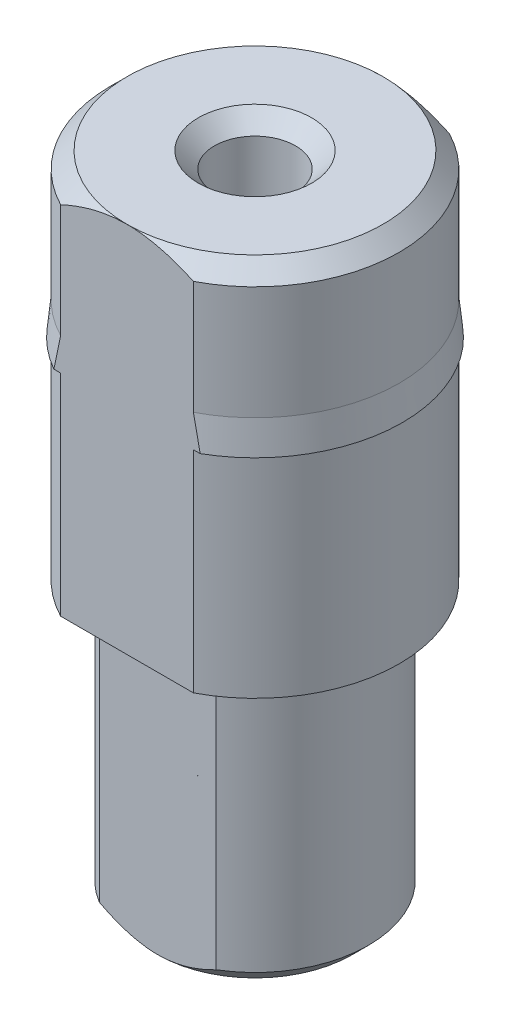
ISO-10303-21;
HEADER;
FILE_DESCRIPTION(('STEP AP214'),'2;1');
FILE_NAME('part.step','',(''),(''),'','','');
FILE_SCHEMA(('AUTOMOTIVE_DESIGN { 1 0 10303 214 1 1 1 1 }'));
ENDSEC;
DATA;
#1=APPLICATION_CONTEXT('core data for automotive mechanical design processes');
#2=APPLICATION_PROTOCOL_DEFINITION('international standard','automotive_design',2000,#1);
#3=PRODUCT_CONTEXT('',#1,'mechanical');
#4=PRODUCT('Part','Part','',(#3));
#5=PRODUCT_RELATED_PRODUCT_CATEGORY('part','',(#4));
#6=PRODUCT_DEFINITION_FORMATION('','',#4);
#7=PRODUCT_DEFINITION_CONTEXT('part definition',#1,'design');
#8=PRODUCT_DEFINITION('design','',#6,#7);
#9=PRODUCT_DEFINITION_SHAPE('','',#8);
#10=(LENGTH_UNIT() NAMED_UNIT(*) SI_UNIT(.MILLI.,.METRE.));
#11=(NAMED_UNIT(*) PLANE_ANGLE_UNIT() SI_UNIT($,.RADIAN.));
#12=(NAMED_UNIT(*) SI_UNIT($,.STERADIAN.) SOLID_ANGLE_UNIT());
#13=UNCERTAINTY_MEASURE_WITH_UNIT(LENGTH_MEASURE(1.E-05),#10,'distance_accuracy_value','');
#14=(GEOMETRIC_REPRESENTATION_CONTEXT(3) GLOBAL_UNCERTAINTY_ASSIGNED_CONTEXT((#13)) GLOBAL_UNIT_ASSIGNED_CONTEXT((#10,
#11,#12)) REPRESENTATION_CONTEXT('',''));
#15=CARTESIAN_POINT('',(0.,0.,0.));
#16=DIRECTION('',(0.,0.,1.));
#17=DIRECTION('',(1.,0.,0.));
#18=AXIS2_PLACEMENT_3D('',#15,#16,#17);
#19=CARTESIAN_POINT('',(-4.565003659,15.,3.95));
#20=DIRECTION('',(0.,-1.,0.));
#21=DIRECTION('',(0.,0.,-1.));
#22=AXIS2_PLACEMENT_3D('',#19,#20,#21);
#23=PLANE('',#22);
#24=DIRECTION('',(-1.,0.,0.));
#25=VECTOR('',#24,1.);
#26=CARTESIAN_POINT('',(-3.2996950765,15.,3.95));
#27=LINE('',#26,#25);
#28=CARTESIAN_POINT('',(-2.04939015250535,15.,3.95));
#29=VERTEX_POINT('',#28);
#30=CARTESIAN_POINT('',(-2.25831795812725,15.,3.95));
#31=VERTEX_POINT('',#30);
#32=EDGE_CURVE('E447',#29,#31,#27,.T.);
#33=ORIENTED_EDGE('',*,*,#32,.T.);
#34=CARTESIAN_POINT('',(0.,14.9999999999999,0.));
#35=DIRECTION('',(0.,-1.,0.));
#36=DIRECTION('',(0.,0.,-1.));
#37=AXIS2_PLACEMENT_3D('',#34,#35,#36);
#38=CIRCLE('',#37,4.55000000000001);
#39=CARTESIAN_POINT('',(-2.2583179582148,14.9999999995654,-3.95));
#40=VERTEX_POINT('',#39);
#41=EDGE_CURVE('E306',#31,#40,#38,.T.);
#42=ORIENTED_EDGE('',*,*,#41,.T.);
#43=DIRECTION('',(1.,0.,0.));
#44=VECTOR('',#43,1.);
#45=CARTESIAN_POINT('',(-3.2996950765,15.,-3.95));
#46=LINE('',#45,#44);
#47=CARTESIAN_POINT('',(-2.04939015250535,15.,-3.95));
#48=VERTEX_POINT('',#47);
#49=EDGE_CURVE('E449',#40,#48,#46,.T.);
#50=ORIENTED_EDGE('',*,*,#49,.T.);
#51=CARTESIAN_POINT('',(0.,15.,0.));
#52=DIRECTION('',(0.,-1.,0.));
#53=DIRECTION('',(1.,0.,0.));
#54=AXIS2_PLACEMENT_3D('',#51,#52,#53);
#55=CIRCLE('',#54,4.45);
#56=EDGE_CURVE('E455',#48,#29,#55,.F.);
#57=ORIENTED_EDGE('',*,*,#56,.T.);
#58=EDGE_LOOP('',(#33,#42,#50,#57));
#59=FACE_BOUND('',#58,.T.);
#60=ADVANCED_FACE('F17',(#59),#23,.T.);
#61=CARTESIAN_POINT('',(0.,8.5,0.));
#62=DIRECTION('',(0.,-1.,0.));
#63=DIRECTION('',(0.,0.,-1.));
#64=AXIS2_PLACEMENT_3D('',#61,#62,#63);
#65=CYLINDRICAL_SURFACE('',#64,3.5);
#66=CARTESIAN_POINT('',(0.,8.5,0.));
#67=DIRECTION('',(0.,-1.,0.));
#68=DIRECTION('',(0.,0.,-1.));
#69=AXIS2_PLACEMENT_3D('',#66,#67,#68);
#70=CIRCLE('',#69,3.5);
#71=CARTESIAN_POINT('',(1.80277564077817,8.5,2.99999999825));
#72=VERTEX_POINT('',#71);
#73=CARTESIAN_POINT('',(1.80277564077817,8.5,-2.99999999825));
#74=VERTEX_POINT('',#73);
#75=EDGE_CURVE('E402',#72,#74,#70,.F.);
#76=ORIENTED_EDGE('',*,*,#75,.F.);
#77=DIRECTION('',(0.,-1.,0.));
#78=VECTOR('',#77,1.);
#79=CARTESIAN_POINT('',(1.802775638,4.2245,3.));
#80=LINE('',#79,#78);
#81=CARTESIAN_POINT('',(1.802775637866,0.500000000068994,3.));
#82=VERTEX_POINT('',#81);
#83=EDGE_CURVE('E169',#72,#82,#80,.T.);
#84=ORIENTED_EDGE('',*,*,#83,.T.);
#85=CARTESIAN_POINT('',(0.,0.499999999999945,0.));
#86=DIRECTION('',(0.,1.,0.));
#87=DIRECTION('',(0.,0.,1.));
#88=AXIS2_PLACEMENT_3D('',#85,#86,#87);
#89=CIRCLE('',#88,3.5);
#90=CARTESIAN_POINT('',(1.80277563773255,0.500000000000285,-3.));
#91=VERTEX_POINT('',#90);
#92=EDGE_CURVE('E193',#82,#91,#89,.T.);
#93=ORIENTED_EDGE('',*,*,#92,.T.);
#94=DIRECTION('',(0.,1.,0.));
#95=VECTOR('',#94,1.);
#96=CARTESIAN_POINT('',(1.802775638,4.2245,-3.));
#97=LINE('',#96,#95);
#98=EDGE_CURVE('E443',#91,#74,#97,.T.);
#99=ORIENTED_EDGE('',*,*,#98,.T.);
#100=EDGE_LOOP('',(#76,#84,#93,#99));
#101=FACE_BOUND('',#100,.T.);
#102=ADVANCED_FACE('F323',(#101),#65,.T.);
#103=CARTESIAN_POINT('',(-1.802775638,-0.051,-3.));
#104=DIRECTION('',(0.,0.,1.));
#105=DIRECTION('',(1.,0.,0.));
#106=AXIS2_PLACEMENT_3D('',#103,#104,#105);
#107=PLANE('',#106);
#108=DIRECTION('',(-1.,0.,0.));
#109=VECTOR('',#108,1.);
#110=CARTESIAN_POINT('',(0.,8.5,-2.9999999965));
#111=LINE('',#110,#109);
#112=CARTESIAN_POINT('',(-1.80277564097783,8.5,-2.9999999980495));
#113=VERTEX_POINT('',#112);
#114=EDGE_CURVE('E399',#74,#113,#111,.T.);
#115=ORIENTED_EDGE('',*,*,#114,.F.);
#116=ORIENTED_EDGE('',*,*,#98,.F.);
#117=CARTESIAN_POINT('',(1.80277563749583,0.499999999802859,-3.00000000013552));
#118=CARTESIAN_POINT('',(1.74059799916989,0.467980227535926,-3.00000000004997));
#119=CARTESIAN_POINT('',(1.67793156288771,0.436912729643096,-3.00000000001369));
#120=CARTESIAN_POINT('',(1.55150481095829,0.376989183162009,-2.9999999999863));
#121=CARTESIAN_POINT('',(1.48774384320323,0.348134513168375,-2.99999999999521));
#122=CARTESIAN_POINT('',(1.29390940841206,0.265043685178306,-3.00000000000963));
#123=CARTESIAN_POINT('',(1.1621055921902,0.214713573566235,-3.00000000000254));
#124=CARTESIAN_POINT('',(0.898117110232975,0.129141794008996,-2.99999999999754));
#125=CARTESIAN_POINT('',(0.766070510700231,0.0934813168375939,-2.99999999999936));
#126=CARTESIAN_POINT('',(0.498920669687579,0.0384190268531843,-3.00000000000063));
#127=CARTESIAN_POINT('',(0.36382927640349,0.018962633927783,-3.00000000000009));
#128=CARTESIAN_POINT('',(0.190263755353593,0.00578686201031933,-2.99999999999998));
#129=CARTESIAN_POINT('',(0.152341872402627,0.00362502580761151,-2.99999999999999));
#130=CARTESIAN_POINT('',(0.0762827731524233,0.000729165844277481,-3.00000000000001));
#131=CARTESIAN_POINT('',(0.0381453252268328,1.23000245343402E-06,-3.00000000000002));
#132=CARTESIAN_POINT('',(-6.1530964462863E-10,0.,-3.));
#133=B_SPLINE_CURVE_WITH_KNOTS('',3,(#117,#118,#119,#120,#121,#122,#123,#124,#125,#126,#127,
#128,#129,#130,#131,#132),.UNSPECIFIED.,.F.,.F.,(4,2,2,2,2,2,2,4),(0.,0.209796717217032,
0.419723093796895,0.842353911309675,1.25190313187514,1.66006722651482,1.77399802873899,
1.88841151384664),.UNSPECIFIED.);
#134=CARTESIAN_POINT('',(-6.15309619412179E-10,0.,-3.));
#135=VERTEX_POINT('',#134);
#136=EDGE_CURVE('E307',#91,#135,#133,.T.);
#137=ORIENTED_EDGE('',*,*,#136,.T.);
#138=CARTESIAN_POINT('',(-6.15309619538574E-10,0.,-3.));
#139=CARTESIAN_POINT('',(-0.0460840994652807,-3.6941433051602E-06,-3.));
#140=CARTESIAN_POINT('',(-0.0921613164449531,0.00106240437093954,-3.));
#141=CARTESIAN_POINT('',(-0.184211814927705,0.00529939845313604,-3.));
#142=CARTESIAN_POINT('',(-0.230185111699788,0.0084699614961064,-3.));
#143=CARTESIAN_POINT('',(-0.367651467400195,0.0210698029959266,-3.));
#144=CARTESIAN_POINT('',(-0.458876724465673,0.0335875136790476,-3.));
#145=CARTESIAN_POINT('',(-0.638535562680846,0.0659462631301394,-3.));
#146=CARTESIAN_POINT('',(-0.72699050121273,0.0856718471588858,-3.));
#147=CARTESIAN_POINT('',(-0.902223751822309,0.131589533597441,-3.));
#148=CARTESIAN_POINT('',(-0.989001482320416,0.157783837177736,-3.));
#149=CARTESIAN_POINT('',(-1.13712031289708,0.207740864029572,-3.));
#150=CARTESIAN_POINT('',(-1.19890904958656,0.230199464833354,-3.));
#151=CARTESIAN_POINT('',(-1.32148458483405,0.2776714674565,-3.));
#152=CARTESIAN_POINT('',(-1.38227154234139,0.302684459356221,-3.));
#153=CARTESIAN_POINT('',(-1.50357773002713,0.355252574055036,-3.));
#154=CARTESIAN_POINT('',(-1.5640854643207,0.382834064727993,-3.));
#155=CARTESIAN_POINT('',(-1.68413781325299,0.439991922713463,-3.));
#156=CARTESIAN_POINT('',(-1.74368262236723,0.469567880817608,-3.));
#157=CARTESIAN_POINT('',(-1.80277563848523,0.500000000387977,-3.));
#158=B_SPLINE_CURVE_WITH_KNOTS('',3,(#138,#139,#140,#141,#142,#143,#144,#145,#146,#147,#148,
#149,#150,#151,#152,#153,#154,#155,#156,#157),.UNSPECIFIED.,.F.,.F.,(4,2,2,2,2,2,2,2,2,4),(0.,
0.138226809152246,0.276431782379928,0.552286625444179,0.823903796946395,1.09561352177657,
1.2927879730921,1.48993083212413,1.68938519780777,1.88879876487008),.UNSPECIFIED.);
#159=CARTESIAN_POINT('',(-1.80277563806566,0.499999999999973,-2.99999999979949));
#160=VERTEX_POINT('',#159);
#161=EDGE_CURVE('E181',#135,#160,#158,.T.);
#162=ORIENTED_EDGE('',*,*,#161,.T.);
#163=DIRECTION('',(0.,-1.,0.));
#164=VECTOR('',#163,1.);
#165=CARTESIAN_POINT('',(-1.80277563839932,4.5,-2.99999999959899));
#166=LINE('',#165,#164);
#167=EDGE_CURVE('E170',#160,#113,#166,.F.);
#168=ORIENTED_EDGE('',*,*,#167,.T.);
#169=EDGE_LOOP('',(#115,#116,#137,#162,#168));
#170=FACE_BOUND('',#169,.T.);
#171=ADVANCED_FACE('F319',(#170),#107,.F.);
#172=CARTESIAN_POINT('',(0.,8.5,0.));
#173=DIRECTION('',(0.,-1.,0.));
#174=DIRECTION('',(0.,0.,-1.));
#175=AXIS2_PLACEMENT_3D('',#172,#173,#174);
#176=CYLINDRICAL_SURFACE('',#175,3.5);
#177=CARTESIAN_POINT('',(0.,0.499999999999945,0.));
#178=DIRECTION('',(0.,1.,0.));
#179=DIRECTION('',(0.,0.,1.));
#180=AXIS2_PLACEMENT_3D('',#177,#178,#179);
#181=CIRCLE('',#180,3.5);
#182=CARTESIAN_POINT('',(-1.80277563808214,0.500000000111304,3.));
#183=VERTEX_POINT('',#182);
#184=EDGE_CURVE('E176',#160,#183,#181,.T.);
#185=ORIENTED_EDGE('',*,*,#184,.T.);
#186=DIRECTION('',(0.,1.,0.));
#187=VECTOR('',#186,1.);
#188=CARTESIAN_POINT('',(-1.802775638,4.2245,3.));
#189=LINE('',#188,#187);
#190=CARTESIAN_POINT('',(-1.80277564077817,8.5,2.99999999825));
#191=VERTEX_POINT('',#190);
#192=EDGE_CURVE('E158',#183,#191,#189,.T.);
#193=ORIENTED_EDGE('',*,*,#192,.T.);
#194=CARTESIAN_POINT('',(0.,8.5,0.));
#195=DIRECTION('',(0.,-1.,0.));
#196=DIRECTION('',(0.,0.,-1.));
#197=AXIS2_PLACEMENT_3D('',#194,#195,#196);
#198=CIRCLE('',#197,3.5);
#199=EDGE_CURVE('E398',#113,#191,#198,.F.);
#200=ORIENTED_EDGE('',*,*,#199,.F.);
#201=ORIENTED_EDGE('',*,*,#167,.F.);
#202=EDGE_LOOP('',(#185,#193,#200,#201));
#203=FACE_BOUND('',#202,.T.);
#204=ADVANCED_FACE('F182',(#203),#176,.T.);
#205=CARTESIAN_POINT('',(1.802775638,-0.051,3.));
#206=DIRECTION('',(0.,0.,-1.));
#207=DIRECTION('',(-1.,0.,0.));
#208=AXIS2_PLACEMENT_3D('',#205,#206,#207);
#209=PLANE('',#208);
#210=DIRECTION('',(1.,0.,0.));
#211=VECTOR('',#210,1.);
#212=CARTESIAN_POINT('',(0.,8.5,2.9999999965));
#213=LINE('',#212,#211);
#214=EDGE_CURVE('E164',#191,#72,#213,.T.);
#215=ORIENTED_EDGE('',*,*,#214,.F.);
#216=ORIENTED_EDGE('',*,*,#192,.F.);
#217=CARTESIAN_POINT('',(-1.80277563816428,0.500000000222663,3.));
#218=CARTESIAN_POINT('',(-1.7405979998369,0.467980227898223,3.));
#219=CARTESIAN_POINT('',(-1.67793156354221,0.436912729969964,3.));
#220=CARTESIAN_POINT('',(-1.55150481157755,0.37698918343884,3.));
#221=CARTESIAN_POINT('',(-1.48774384379976,0.348134513430598,3.));
#222=CARTESIAN_POINT('',(-1.29390940894163,0.265043685392213,3.));
#223=CARTESIAN_POINT('',(-1.16210559267718,0.214713573742106,3.));
#224=CARTESIAN_POINT('',(-0.898117110631753,0.129141794120821,3.));
#225=CARTESIAN_POINT('',(-0.76607051105363,0.093481316922939,3.));
#226=CARTESIAN_POINT('',(-0.498920669947155,0.0384190268942928,3.));
#227=CARTESIAN_POINT('',(-0.363829276614636,0.0189626339510926,3.));
#228=CARTESIAN_POINT('',(-0.190263755601701,0.00578686202710394,3.));
#229=CARTESIAN_POINT('',(-0.152341872737199,0.00362502582566791,3.));
#230=CARTESIAN_POINT('',(-0.0762827736607085,0.000729165858313931,3.));
#231=CARTESIAN_POINT('',(-0.0381453258223677,1.23001115626984E-06,3.));
#232=CARTESIAN_POINT('',(-6.73453388702835E-11,0.,3.));
#233=B_SPLINE_CURVE_WITH_KNOTS('',3,(#217,#218,#219,#220,#221,#222,#223,#224,#225,#226,#227,
#228,#229,#230,#231,#232),.UNSPECIFIED.,.F.,.F.,(4,2,2,2,2,2,2,4),(0.,0.20979671729781,
0.41972309395742,0.842353911630949,1.2519031323475,1.66006722713743,1.77399802910257,
1.88841151394897),.UNSPECIFIED.);
#234=CARTESIAN_POINT('',(-3.36726565919468E-11,0.,3.));
#235=VERTEX_POINT('',#234);
#236=EDGE_CURVE('E21',#183,#235,#233,.T.);
#237=ORIENTED_EDGE('',*,*,#236,.T.);
#238=CARTESIAN_POINT('',(-6.73453131838936E-11,0.,3.));
#239=CARTESIAN_POINT('',(0.0460840987747339,-3.69415378986877E-06,3.));
#240=CARTESIAN_POINT('',(0.0921613157467651,0.00106240434960413,3.));
#241=CARTESIAN_POINT('',(0.184211814214771,0.00529939840954038,3.));
#242=CARTESIAN_POINT('',(0.23018511097975,0.00846996144110207,3.));
#243=CARTESIAN_POINT('',(0.367651466659799,0.0210698029061708,3.));
#244=CARTESIAN_POINT('',(0.458876723712821,0.0335875135653797,3.));
#245=CARTESIAN_POINT('',(0.638535561904433,0.0659462629686653,3.));
#246=CARTESIAN_POINT('',(0.726990500425194,0.0856718469734601,3.));
#247=CARTESIAN_POINT('',(0.902223751013889,0.131589533364651,3.));
#248=CARTESIAN_POINT('',(0.989001481502234,0.157783836921531,3.));
#249=CARTESIAN_POINT('',(1.13712031209498,0.2077408637447,3.));
#250=CARTESIAN_POINT('',(1.19890904880956,0.230199464544477,3.));
#251=CARTESIAN_POINT('',(1.32148458410658,0.27767146716272,3.));
#252=CARTESIAN_POINT('',(1.38227154163835,0.302684459061544,3.));
#253=CARTESIAN_POINT('',(1.50357772937319,0.355252573761538,3.));
#254=CARTESIAN_POINT('',(1.56408546369141,0.382834064436631,3.));
#255=CARTESIAN_POINT('',(1.68413781267208,0.439991922428673,3.));
#256=CARTESIAN_POINT('',(1.74368262181006,0.469567880537252,3.));
#257=CARTESIAN_POINT('',(1.80277563795139,0.500000000113005,3.));
#258=B_SPLINE_CURVE_WITH_KNOTS('',3,(#238,#239,#240,#241,#242,#243,#244,#245,#246,#247,#248,
#249,#250,#251,#252,#253,#254,#255,#256,#257),.UNSPECIFIED.,.F.,.F.,(4,2,2,2,2,2,2,2,2,4),(0.,
0.138226809128589,0.276431782332671,0.552286625350198,0.823903796804165,1.09561352158594,
1.29278797296803,1.48993083206671,1.68938519782021,1.88879876495213),.UNSPECIFIED.);
#259=EDGE_CURVE('E315',#235,#82,#258,.T.);
#260=ORIENTED_EDGE('',*,*,#259,.T.);
#261=ORIENTED_EDGE('',*,*,#83,.F.);
#262=EDGE_LOOP('',(#215,#216,#237,#260,#261));
#263=FACE_BOUND('',#262,.T.);
#264=ADVANCED_FACE('F160',(#263),#209,.F.);
#265=CARTESIAN_POINT('',(2.034386494,15.,3.95));
#266=DIRECTION('',(0.,-1.,0.));
#267=DIRECTION('',(0.,0.,-1.));
#268=AXIS2_PLACEMENT_3D('',#265,#266,#267);
#269=PLANE('',#268);
#270=DIRECTION('',(-1.,0.,0.));
#271=VECTOR('',#270,1.);
#272=CARTESIAN_POINT('',(3.2996950765,15.,3.95));
#273=LINE('',#272,#271);
#274=CARTESIAN_POINT('',(2.25831795822744,14.9999999995027,3.95));
#275=VERTEX_POINT('',#274);
#276=CARTESIAN_POINT('',(2.04939015250535,15.,3.95));
#277=VERTEX_POINT('',#276);
#278=EDGE_CURVE('E185',#275,#277,#273,.T.);
#279=ORIENTED_EDGE('',*,*,#278,.T.);
#280=CARTESIAN_POINT('',(0.,15.,0.));
#281=DIRECTION('',(0.,-1.,0.));
#282=DIRECTION('',(1.,0.,0.));
#283=AXIS2_PLACEMENT_3D('',#280,#281,#282);
#284=CIRCLE('',#283,4.45);
#285=CARTESIAN_POINT('',(2.04939015250535,15.,-3.95));
#286=VERTEX_POINT('',#285);
#287=EDGE_CURVE('E475',#277,#286,#284,.F.);
#288=ORIENTED_EDGE('',*,*,#287,.T.);
#289=DIRECTION('',(1.,0.,0.));
#290=VECTOR('',#289,1.);
#291=CARTESIAN_POINT('',(3.2996950765,15.,-3.95));
#292=LINE('',#291,#290);
#293=CARTESIAN_POINT('',(2.25831795812725,15.,-3.95));
#294=VERTEX_POINT('',#293);
#295=EDGE_CURVE('E190',#286,#294,#292,.T.);
#296=ORIENTED_EDGE('',*,*,#295,.T.);
#297=CARTESIAN_POINT('',(0.,14.9999999999999,0.));
#298=DIRECTION('',(0.,-1.,0.));
#299=DIRECTION('',(0.,0.,-1.));
#300=AXIS2_PLACEMENT_3D('',#297,#298,#299);
#301=CIRCLE('',#300,4.55000000000001);
#302=EDGE_CURVE('E271',#294,#275,#301,.T.);
#303=ORIENTED_EDGE('',*,*,#302,.T.);
#304=EDGE_LOOP('',(#279,#288,#296,#303));
#305=FACE_BOUND('',#304,.T.);
#306=ADVANCED_FACE('F336',(#305),#269,.T.);
#307=CARTESIAN_POINT('',(0.,0.,0.));
#308=DIRECTION('',(0.,1.,0.));
#309=DIRECTION('',(0.,0.,1.));
#310=AXIS2_PLACEMENT_3D('',#307,#308,#309);
#311=CONICAL_SURFACE('',#310,3.,0.785398163397448);
#312=CARTESIAN_POINT('',(0.,0.,0.));
#313=DIRECTION('',(0.,1.,0.));
#314=DIRECTION('',(0.,0.,1.));
#315=AXIS2_PLACEMENT_3D('',#312,#313,#314);
#316=CIRCLE('',#315,3.);
#317=EDGE_CURVE('E179',#235,#135,#316,.F.);
#318=ORIENTED_EDGE('',*,*,#317,.F.);
#319=ORIENTED_EDGE('',*,*,#236,.F.);
#320=ORIENTED_EDGE('',*,*,#184,.F.);
#321=ORIENTED_EDGE('',*,*,#161,.F.);
#322=EDGE_LOOP('',(#318,#319,#320,#321));
#323=FACE_BOUND('',#322,.T.);
#324=ADVANCED_FACE('F175',(#323),#311,.T.);
#325=CARTESIAN_POINT('',(0.,0.,0.));
#326=DIRECTION('',(0.,1.,0.));
#327=DIRECTION('',(0.,0.,1.));
#328=AXIS2_PLACEMENT_3D('',#325,#326,#327);
#329=CONICAL_SURFACE('',#328,3.,0.785398163397448);
#330=ORIENTED_EDGE('',*,*,#92,.F.);
#331=ORIENTED_EDGE('',*,*,#259,.F.);
#332=CARTESIAN_POINT('',(0.,0.,0.));
#333=DIRECTION('',(0.,1.,0.));
#334=DIRECTION('',(0.,0.,1.));
#335=AXIS2_PLACEMENT_3D('',#332,#333,#334);
#336=CIRCLE('',#335,3.);
#337=EDGE_CURVE('E420',#135,#235,#336,.F.);
#338=ORIENTED_EDGE('',*,*,#337,.F.);
#339=ORIENTED_EDGE('',*,*,#136,.F.);
#340=EDGE_LOOP('',(#330,#331,#338,#339));
#341=FACE_BOUND('',#340,.T.);
#342=ADVANCED_FACE('F290',(#341),#329,.T.);
#343=CARTESIAN_POINT('',(0.,16.,0.));
#344=DIRECTION('',(0.,-1.,0.));
#345=DIRECTION('',(0.,0.,-1.));
#346=AXIS2_PLACEMENT_3D('',#343,#344,#345);
#347=CONICAL_SURFACE('',#346,4.45,0.0996686524911622);
#348=ORIENTED_EDGE('',*,*,#41,.F.);
#349=CARTESIAN_POINT('',(-2.04939015290256,16.0000000013756,3.95000000003666));
#350=CARTESIAN_POINT('',(-2.08545844786843,15.8335938390212,3.95000000001833));
#351=CARTESIAN_POINT('',(-2.12090324841155,15.667057411346,3.95000000000611));
#352=CARTESIAN_POINT('',(-2.19054584982861,15.3337240771599,3.94999999999389));
#353=CARTESIAN_POINT('',(-2.22474365109016,15.16692717073,3.94999999999389));
#354=CARTESIAN_POINT('',(-2.25831795831657,14.9999999990603,3.95));
#355=B_SPLINE_CURVE_WITH_KNOTS('',3,(#349,#350,#351,#352,#353,#354),.UNSPECIFIED.,.F.,.F.,(4,2,
4),(0.,0.510799804869968,1.02159945096563),.UNSPECIFIED.);
#356=CARTESIAN_POINT('',(-2.04939015235621,16.0000000006868,3.95));
#357=VERTEX_POINT('',#356);
#358=EDGE_CURVE('E299',#357,#31,#355,.T.);
#359=ORIENTED_EDGE('',*,*,#358,.F.);
#360=CARTESIAN_POINT('',(0.,16.,0.));
#361=DIRECTION('',(0.,-1.,0.));
#362=DIRECTION('',(0.,0.,-1.));
#363=AXIS2_PLACEMENT_3D('',#360,#361,#362);
#364=CIRCLE('',#363,4.45);
#365=CARTESIAN_POINT('',(-2.04939015234596,16.0000000007341,-3.95));
#366=VERTEX_POINT('',#365);
#367=EDGE_CURVE('E415',#357,#366,#364,.T.);
#368=ORIENTED_EDGE('',*,*,#367,.T.);
#369=CARTESIAN_POINT('',(-2.25831795830236,14.9999999991309,-3.95));
#370=CARTESIAN_POINT('',(-2.22474365107646,15.1669271708049,-3.95));
#371=CARTESIAN_POINT('',(-2.19054584981389,15.3337240772389,-3.95));
#372=CARTESIAN_POINT('',(-2.12090324839171,15.6670574114325,-3.95));
#373=CARTESIAN_POINT('',(-2.0854584478445,15.8335938391112,-3.95));
#374=CARTESIAN_POINT('',(-2.04939015287301,16.0000000014687,-3.95));
#375=B_SPLINE_CURVE_WITH_KNOTS('',3,(#369,#370,#371,#372,#373,#374),.UNSPECIFIED.,.F.,.F.,(4,2,
4),(0.,0.510799646108253,1.02159945099085),.UNSPECIFIED.);
#376=EDGE_CURVE('E294',#40,#366,#375,.T.);
#377=ORIENTED_EDGE('',*,*,#376,.F.);
#378=EDGE_LOOP('',(#348,#359,#368,#377));
#379=FACE_BOUND('',#378,.T.);
#380=ADVANCED_FACE('F283',(#379),#347,.T.);
#381=CARTESIAN_POINT('',(0.,16.,0.));
#382=DIRECTION('',(0.,-1.,0.));
#383=DIRECTION('',(0.,0.,-1.));
#384=AXIS2_PLACEMENT_3D('',#381,#382,#383);
#385=CONICAL_SURFACE('',#384,4.45,0.0996686524911622);
#386=CARTESIAN_POINT('',(0.,16.,0.));
#387=DIRECTION('',(0.,-1.,0.));
#388=DIRECTION('',(0.,0.,-1.));
#389=AXIS2_PLACEMENT_3D('',#386,#387,#388);
#390=CIRCLE('',#389,4.45);
#391=CARTESIAN_POINT('',(2.04939015238243,16.0000000005661,-3.95));
#392=VERTEX_POINT('',#391);
#393=CARTESIAN_POINT('',(2.0493901523642,16.0000000006501,3.95));
#394=VERTEX_POINT('',#393);
#395=EDGE_CURVE('E419',#392,#394,#390,.T.);
#396=ORIENTED_EDGE('',*,*,#395,.T.);
#397=CARTESIAN_POINT('',(2.25831795832764,14.9999999990054,3.95));
#398=CARTESIAN_POINT('',(2.22474365110348,15.1669271706722,3.95));
#399=CARTESIAN_POINT('',(2.19054584984272,15.333724077099,3.95));
#400=CARTESIAN_POINT('',(2.12090324842433,15.6670574112782,3.95));
#401=CARTESIAN_POINT('',(2.08545844787909,15.8335938389496,3.95));
#402=CARTESIAN_POINT('',(2.04939015290965,16.0000000012999,3.95));
#403=B_SPLINE_CURVE_WITH_KNOTS('',3,(#397,#398,#399,#400,#401,#402),.UNSPECIFIED.,.F.,.F.,(4,2,
4),(0.,0.510799646085911,1.02159945094616),.UNSPECIFIED.);
#404=EDGE_CURVE('E262',#275,#394,#403,.T.);
#405=ORIENTED_EDGE('',*,*,#404,.F.);
#406=ORIENTED_EDGE('',*,*,#302,.F.);
#407=CARTESIAN_POINT('',(2.04939015294609,16.0000000011322,-3.95));
#408=CARTESIAN_POINT('',(2.08545844790252,15.8335938388397,-3.95));
#409=CARTESIAN_POINT('',(2.12090324843518,15.6670574112263,-3.95));
#410=CARTESIAN_POINT('',(2.19054584982928,15.3337240771633,-3.95));
#411=CARTESIAN_POINT('',(2.22474365107833,15.1669271707947,-3.95));
#412=CARTESIAN_POINT('',(2.25831795829122,14.9999999991861,-3.95));
#413=B_SPLINE_CURVE_WITH_KNOTS('',3,(#407,#408,#409,#410,#411,#412),.UNSPECIFIED.,.F.,.F.,(4,2,
4),(0.,0.510799804682207,1.02159945059007),.UNSPECIFIED.);
#414=EDGE_CURVE('E270',#392,#294,#413,.T.);
#415=ORIENTED_EDGE('',*,*,#414,.F.);
#416=EDGE_LOOP('',(#396,#405,#406,#415));
#417=FACE_BOUND('',#416,.T.);
#418=ADVANCED_FACE('F277',(#417),#385,.T.);
#419=CARTESIAN_POINT('',(0.,15.,0.));
#420=DIRECTION('',(0.,-1.,0.));
#421=DIRECTION('',(1.,0.,0.));
#422=AXIS2_PLACEMENT_3D('',#419,#420,#421);
#423=CYLINDRICAL_SURFACE('',#422,4.45);
#424=CARTESIAN_POINT('',(0.,8.5,0.));
#425=DIRECTION('',(0.,-1.,0.));
#426=DIRECTION('',(1.,0.,0.));
#427=AXIS2_PLACEMENT_3D('',#424,#425,#426);
#428=CIRCLE('',#427,4.45);
#429=CARTESIAN_POINT('',(-2.04939015250535,8.5,3.95));
#430=VERTEX_POINT('',#429);
#431=CARTESIAN_POINT('',(-2.04939015250535,8.5,-3.95));
#432=VERTEX_POINT('',#431);
#433=EDGE_CURVE('E462',#430,#432,#428,.T.);
#434=ORIENTED_EDGE('',*,*,#433,.F.);
#435=DIRECTION('',(0.,1.,0.));
#436=VECTOR('',#435,1.);
#437=CARTESIAN_POINT('',(-2.04939015181878,14.2845,3.95));
#438=LINE('',#437,#436);
#439=EDGE_CURVE('E432',#430,#29,#438,.T.);
#440=ORIENTED_EDGE('',*,*,#439,.T.);
#441=ORIENTED_EDGE('',*,*,#56,.F.);
#442=DIRECTION('',(0.,-1.,0.));
#443=VECTOR('',#442,1.);
#444=CARTESIAN_POINT('',(-2.04939015181878,14.2845,-3.95));
#445=LINE('',#444,#443);
#446=EDGE_CURVE('E403',#48,#432,#445,.T.);
#447=ORIENTED_EDGE('',*,*,#446,.T.);
#448=EDGE_LOOP('',(#434,#440,#441,#447));
#449=FACE_BOUND('',#448,.T.);
#450=ADVANCED_FACE('F282',(#449),#423,.T.);
#451=CARTESIAN_POINT('',(-4.5034,8.5,3.95));
#452=DIRECTION('',(0.,-1.,0.));
#453=DIRECTION('',(0.,0.,-1.));
#454=AXIS2_PLACEMENT_3D('',#451,#452,#453);
#455=PLANE('',#454);
#456=ORIENTED_EDGE('',*,*,#199,.T.);
#457=ORIENTED_EDGE('',*,*,#214,.T.);
#458=ORIENTED_EDGE('',*,*,#75,.T.);
#459=ORIENTED_EDGE('',*,*,#114,.T.);
#460=EDGE_LOOP('',(#456,#457,#458,#459));
#461=FACE_BOUND('',#460,.T.);
#462=DIRECTION('',(-1.,0.,0.));
#463=VECTOR('',#462,1.);
#464=CARTESIAN_POINT('',(0.,8.5,3.95));
#465=LINE('',#464,#463);
#466=CARTESIAN_POINT('',(2.04939015250535,8.5,3.95));
#467=VERTEX_POINT('',#466);
#468=EDGE_CURVE('E428',#467,#430,#465,.T.);
#469=ORIENTED_EDGE('',*,*,#468,.T.);
#470=ORIENTED_EDGE('',*,*,#433,.T.);
#471=DIRECTION('',(1.,0.,0.));
#472=VECTOR('',#471,1.);
#473=CARTESIAN_POINT('',(0.,8.5,-3.95));
#474=LINE('',#473,#472);
#475=CARTESIAN_POINT('',(2.04939015250535,8.5,-3.95));
#476=VERTEX_POINT('',#475);
#477=EDGE_CURVE('E407',#432,#476,#474,.T.);
#478=ORIENTED_EDGE('',*,*,#477,.T.);
#479=CARTESIAN_POINT('',(0.,8.5,0.));
#480=DIRECTION('',(0.,-1.,0.));
#481=DIRECTION('',(1.,0.,0.));
#482=AXIS2_PLACEMENT_3D('',#479,#480,#481);
#483=CIRCLE('',#482,4.45);
#484=EDGE_CURVE('E397',#476,#467,#483,.T.);
#485=ORIENTED_EDGE('',*,*,#484,.T.);
#486=EDGE_LOOP('',(#469,#470,#478,#485));
#487=FACE_BOUND('',#486,.T.);
#488=ADVANCED_FACE('F465',(#461,#487),#455,.T.);
#489=CARTESIAN_POINT('',(0.,15.,0.));
#490=DIRECTION('',(0.,-1.,0.));
#491=DIRECTION('',(1.,0.,0.));
#492=AXIS2_PLACEMENT_3D('',#489,#490,#491);
#493=CYLINDRICAL_SURFACE('',#492,4.45);
#494=ORIENTED_EDGE('',*,*,#287,.F.);
#495=DIRECTION('',(0.,-1.,0.));
#496=VECTOR('',#495,1.);
#497=CARTESIAN_POINT('',(2.04939015181878,14.2845,3.95));
#498=LINE('',#497,#496);
#499=EDGE_CURVE('E424',#277,#467,#498,.T.);
#500=ORIENTED_EDGE('',*,*,#499,.T.);
#501=ORIENTED_EDGE('',*,*,#484,.F.);
#502=DIRECTION('',(0.,1.,0.));
#503=VECTOR('',#502,1.);
#504=CARTESIAN_POINT('',(2.04939015181878,14.2845,-3.95));
#505=LINE('',#504,#503);
#506=EDGE_CURVE('E411',#476,#286,#505,.T.);
#507=ORIENTED_EDGE('',*,*,#506,.T.);
#508=EDGE_LOOP('',(#494,#500,#501,#507));
#509=FACE_BOUND('',#508,.T.);
#510=ADVANCED_FACE('F493',(#509),#493,.T.);
#511=CARTESIAN_POINT('',(-3.036,0.,3.036));
#512=DIRECTION('',(0.,-1.,0.));
#513=DIRECTION('',(0.,0.,-1.));
#514=AXIS2_PLACEMENT_3D('',#511,#512,#513);
#515=PLANE('',#514);
#516=CARTESIAN_POINT('',(0.,0.,0.));
#517=DIRECTION('',(0.,-1.,0.));
#518=DIRECTION('',(0.,0.,-1.));
#519=AXIS2_PLACEMENT_3D('',#516,#517,#518);
#520=CIRCLE('',#519,1.75);
#521=CARTESIAN_POINT('',(0.,0.,-1.75));
#522=VERTEX_POINT('',#521);
#523=EDGE_CURVE('E247',#522,#522,#520,.T.);
#524=ORIENTED_EDGE('',*,*,#523,.F.);
#525=EDGE_LOOP('',(#524));
#526=FACE_BOUND('',#525,.T.);
#527=ORIENTED_EDGE('',*,*,#317,.T.);
#528=ORIENTED_EDGE('',*,*,#337,.T.);
#529=EDGE_LOOP('',(#527,#528));
#530=FACE_BOUND('',#529,.T.);
#531=ADVANCED_FACE('F255',(#526,#530),#515,.T.);
#532=CARTESIAN_POINT('',(0.,19.5,0.));
#533=DIRECTION('',(0.,-1.,0.));
#534=DIRECTION('',(0.,0.,-1.));
#535=AXIS2_PLACEMENT_3D('',#532,#533,#534);
#536=CYLINDRICAL_SURFACE('',#535,4.45);
#537=ORIENTED_EDGE('',*,*,#367,.F.);
#538=DIRECTION('',(0.,1.,0.));
#539=VECTOR('',#538,1.);
#540=CARTESIAN_POINT('',(-2.04939015181878,14.2845,3.95));
#541=LINE('',#540,#539);
#542=CARTESIAN_POINT('',(-2.04939015250535,19.5000000003162,3.95));
#543=VERTEX_POINT('',#542);
#544=EDGE_CURVE('E390',#357,#543,#541,.T.);
#545=ORIENTED_EDGE('',*,*,#544,.T.);
#546=CARTESIAN_POINT('',(0.,19.5000000000001,0.));
#547=DIRECTION('',(0.,-1.,0.));
#548=DIRECTION('',(0.,0.,-1.));
#549=AXIS2_PLACEMENT_3D('',#546,#547,#548);
#550=CIRCLE('',#549,4.45);
#551=CARTESIAN_POINT('',(-2.04939015181878,19.5000000003162,-3.95));
#552=VERTEX_POINT('',#551);
#553=EDGE_CURVE('E246',#543,#552,#550,.T.);
#554=ORIENTED_EDGE('',*,*,#553,.T.);
#555=DIRECTION('',(0.,-1.,0.));
#556=VECTOR('',#555,1.);
#557=CARTESIAN_POINT('',(-2.04939015181878,14.2845,-3.95));
#558=LINE('',#557,#556);
#559=EDGE_CURVE('E380',#552,#366,#558,.T.);
#560=ORIENTED_EDGE('',*,*,#559,.T.);
#561=EDGE_LOOP('',(#537,#545,#554,#560));
#562=FACE_BOUND('',#561,.T.);
#563=ADVANCED_FACE('F523',(#562),#536,.T.);
#564=CARTESIAN_POINT('',(0.,19.5,0.));
#565=DIRECTION('',(0.,-1.,0.));
#566=DIRECTION('',(0.,0.,-1.));
#567=AXIS2_PLACEMENT_3D('',#564,#565,#566);
#568=CYLINDRICAL_SURFACE('',#567,4.45);
#569=CARTESIAN_POINT('',(0.,19.5000000000001,0.));
#570=DIRECTION('',(0.,-1.,0.));
#571=DIRECTION('',(0.,0.,-1.));
#572=AXIS2_PLACEMENT_3D('',#569,#570,#571);
#573=CIRCLE('',#572,4.45);
#574=CARTESIAN_POINT('',(2.04939015250535,19.5000000003162,-3.95));
#575=VERTEX_POINT('',#574);
#576=CARTESIAN_POINT('',(2.04939015226493,19.5000000004269,3.95));
#577=VERTEX_POINT('',#576);
#578=EDGE_CURVE('E371',#575,#577,#573,.T.);
#579=ORIENTED_EDGE('',*,*,#578,.T.);
#580=DIRECTION('',(0.,-1.,0.));
#581=VECTOR('',#580,1.);
#582=CARTESIAN_POINT('',(2.04939015181878,14.2845,3.95));
#583=LINE('',#582,#581);
#584=EDGE_CURVE('E367',#577,#394,#583,.T.);
#585=ORIENTED_EDGE('',*,*,#584,.T.);
#586=ORIENTED_EDGE('',*,*,#395,.F.);
#587=DIRECTION('',(0.,1.,0.));
#588=VECTOR('',#587,1.);
#589=CARTESIAN_POINT('',(2.04939015181878,14.2845,-3.95));
#590=LINE('',#589,#588);
#591=EDGE_CURVE('E435',#392,#575,#590,.T.);
#592=ORIENTED_EDGE('',*,*,#591,.T.);
#593=EDGE_LOOP('',(#579,#585,#586,#592));
#594=FACE_BOUND('',#593,.T.);
#595=ADVANCED_FACE('F253',(#594),#568,.T.);
#596=CARTESIAN_POINT('',(2.285417774,8.5,3.95));
#597=DIRECTION('',(0.,0.,-1.));
#598=DIRECTION('',(-1.,0.,0.));
#599=AXIS2_PLACEMENT_3D('',#596,#597,#598);
#600=PLANE('',#599);
#601=ORIENTED_EDGE('',*,*,#468,.F.);
#602=ORIENTED_EDGE('',*,*,#499,.F.);
#603=ORIENTED_EDGE('',*,*,#278,.F.);
#604=ORIENTED_EDGE('',*,*,#404,.T.);
#605=ORIENTED_EDGE('',*,*,#584,.F.);
#606=CARTESIAN_POINT('',(2.04939015265574,19.5000000001013,3.94999999972343));
#607=CARTESIAN_POINT('',(1.9044817695839,19.5667120120816,3.94999999990057));
#608=CARTESIAN_POINT('',(1.75726307525106,19.6289624661965,3.94999999997333));
#609=CARTESIAN_POINT('',(1.45767333081831,19.7419218012292,3.9500000000268));
#610=CARTESIAN_POINT('',(1.30528054915186,19.7925725691132,3.95000000000708));
#611=CARTESIAN_POINT('',(1.00007538163752,19.8779286520752,3.9499999999931));
#612=CARTESIAN_POINT('',(0.847367482840089,19.9129988562393,3.94999999999822));
#613=CARTESIAN_POINT('',(0.539293146928709,19.9662264203428,3.95000000000177));
#614=CARTESIAN_POINT('',(0.383934185182721,19.9844252288042,3.95000000000022));
#615=CARTESIAN_POINT('',(0.190211162435847,19.9956062743859,3.94999999999995));
#616=CARTESIAN_POINT('',(0.152257125887357,19.9972496940682,3.94999999999997));
#617=CARTESIAN_POINT('',(0.0762040329295326,19.9994475451605,3.95000000000003));
#618=CARTESIAN_POINT('',(0.0381048820725311,19.999998707832,3.95000000000005));
#619=CARTESIAN_POINT('',(-8.10158381432179E-10,20.,3.95));
#620=B_SPLINE_CURVE_WITH_KNOTS('',3,(#606,#607,#608,#609,#610,#611,#612,#613,#614,#615,#616,
#617,#618,#619),.UNSPECIFIED.,.F.,.F.,(4,2,2,2,2,2,4),(0.,0.478861953266389,0.960072879349554,
1.42932848854416,1.89742818282179,2.01138692042324,2.12568618425017),.UNSPECIFIED.);
#621=CARTESIAN_POINT('',(-8.10158663569429E-10,20.,3.95));
#622=VERTEX_POINT('',#621);
#623=EDGE_CURVE('E212',#577,#622,#620,.T.);
#624=ORIENTED_EDGE('',*,*,#623,.T.);
#625=CARTESIAN_POINT('',(-8.10158542806563E-10,20.,3.95));
#626=CARTESIAN_POINT('',(-0.0606400796631832,20.0000048482431,3.95));
#627=CARTESIAN_POINT('',(-0.121271140386647,19.9986028857842,3.95));
#628=CARTESIAN_POINT('',(-0.242396604451816,19.9930310234013,3.95));
#629=CARTESIAN_POINT('',(-0.302891027960619,19.9888615629401,3.95));
#630=CARTESIAN_POINT('',(-0.483794208117712,19.9722904768446,3.95));
#631=CARTESIAN_POINT('',(-0.603850797825324,19.9558258051153,3.95));
#632=CARTESIAN_POINT('',(-0.840420813369276,19.9132391059709,3.95));
#633=CARTESIAN_POINT('',(-0.956960354225497,19.8872583774864,3.95));
#634=CARTESIAN_POINT('',(-1.18781364961769,19.826774634933,3.95));
#635=CARTESIAN_POINT('',(-1.30212690166311,19.7922697203981,3.95));
#636=CARTESIAN_POINT('',(-1.522770772002,19.7178541323404,3.95));
#637=CARTESIAN_POINT('',(-1.62921928024186,19.6782878534384,3.95));
#638=CARTESIAN_POINT('',(-1.84062706359254,19.5932804462202,3.95));
#639=CARTESIAN_POINT('',(-1.94557051954092,19.5477998146594,3.95));
#640=CARTESIAN_POINT('',(-2.0493901524099,19.5000000003601,3.95));
#641=B_SPLINE_CURVE_WITH_KNOTS('',3,(#625,#626,#627,#628,#629,#630,#631,#632,#633,#634,#635,
#636,#637,#638,#639,#640),.UNSPECIFIED.,.F.,.F.,(4,2,2,2,2,2,2,4),(0.,0.18188679178553,
0.363744707901628,0.726779338812935,1.08462860059347,1.44255771693188,1.78308430739254,
2.12601494726345),.UNSPECIFIED.);
#642=EDGE_CURVE('E46',#622,#543,#641,.T.);
#643=ORIENTED_EDGE('',*,*,#642,.T.);
#644=ORIENTED_EDGE('',*,*,#544,.F.);
#645=ORIENTED_EDGE('',*,*,#358,.T.);
#646=ORIENTED_EDGE('',*,*,#32,.F.);
#647=ORIENTED_EDGE('',*,*,#439,.F.);
#648=EDGE_LOOP('',(#601,#602,#603,#604,#605,#624,#643,#644,#645,#646,#647));
#649=FACE_BOUND('',#648,.T.);
#650=ADVANCED_FACE('F249',(#649),#600,.F.);
#651=CARTESIAN_POINT('',(-2.285417774,8.5,-3.95));
#652=DIRECTION('',(0.,0.,1.));
#653=DIRECTION('',(1.,0.,0.));
#654=AXIS2_PLACEMENT_3D('',#651,#652,#653);
#655=PLANE('',#654);
#656=ORIENTED_EDGE('',*,*,#477,.F.);
#657=ORIENTED_EDGE('',*,*,#446,.F.);
#658=ORIENTED_EDGE('',*,*,#49,.F.);
#659=ORIENTED_EDGE('',*,*,#376,.T.);
#660=ORIENTED_EDGE('',*,*,#559,.F.);
#661=CARTESIAN_POINT('',(-2.0493901520294,19.5000000005004,-3.9499999999336));
#662=CARTESIAN_POINT('',(-1.90448176896165,19.566712012391,-3.94999999997613));
#663=CARTESIAN_POINT('',(-1.75726307464838,19.6289624664514,-3.9499999999936));
#664=CARTESIAN_POINT('',(-1.45767333026922,19.7419218014083,-3.95000000000644));
#665=CARTESIAN_POINT('',(-1.30528054863684,19.7925725692713,-3.9500000000017));
#666=CARTESIAN_POINT('',(-1.00007538118377,19.8779286521884,-3.94999999999834));
#667=CARTESIAN_POINT('',(-0.847367482413408,19.9129988563285,-3.94999999999957));
#668=CARTESIAN_POINT('',(-0.539293146559804,19.9662264203912,-3.95000000000043));
#669=CARTESIAN_POINT('',(-0.383934184844518,19.9844252288357,-3.95000000000005));
#670=CARTESIAN_POINT('',(-0.190211162343806,19.9956062743883,-3.94999999999999));
#671=CARTESIAN_POINT('',(-0.152257126010226,19.9972496940614,-3.94999999999999));
#672=CARTESIAN_POINT('',(-0.0762040334839083,19.9994475451478,-3.95000000000001));
#673=CARTESIAN_POINT('',(-0.0381048828435049,19.9999987078224,-3.95000000000001));
#674=CARTESIAN_POINT('',(-1.77342548678402E-10,20.,-3.95));
#675=B_SPLINE_CURVE_WITH_KNOTS('',3,(#661,#662,#663,#664,#665,#666,#667,#668,#669,#670,#671,
#672,#673,#674),.UNSPECIFIED.,.F.,.F.,(4,2,2,2,2,2,4),(0.,0.478861953149056,0.960072879116981,
1.42932848821565,1.89742818239674,2.01138691935308,2.12568618253062),.UNSPECIFIED.);
#676=CARTESIAN_POINT('',(-8.867163136064E-11,20.,-3.95));
#677=VERTEX_POINT('',#676);
#678=EDGE_CURVE('E236',#552,#677,#675,.T.);
#679=ORIENTED_EDGE('',*,*,#678,.T.);
#680=CARTESIAN_POINT('',(-1.77342537118052E-10,20.,-3.95));
#681=CARTESIAN_POINT('',(0.0606400786644813,20.0000048482582,-3.95));
#682=CARTESIAN_POINT('',(0.121271139377107,19.998602885815,-3.95));
#683=CARTESIAN_POINT('',(0.242396603421372,19.9930310234642,-3.95));
#684=CARTESIAN_POINT('',(0.30289102692011,19.9888615630195,-3.95));
#685=CARTESIAN_POINT('',(0.483794207048263,19.9722904769742,-3.95));
#686=CARTESIAN_POINT('',(0.603850796738151,19.9558258052794,-3.95));
#687=CARTESIAN_POINT('',(0.840420812247883,19.913239106204,-3.95));
#688=CARTESIAN_POINT('',(0.956960353087599,19.8872583777542,-3.95));
#689=CARTESIAN_POINT('',(1.18781364844885,19.8267746352695,-3.95));
#690=CARTESIAN_POINT('',(1.30212690047983,19.7922697207686,-3.95));
#691=CARTESIAN_POINT('',(1.52277077117824,19.7178541326454,-3.95));
#692=CARTESIAN_POINT('',(1.62921927978391,19.6782878536206,-3.95));
#693=CARTESIAN_POINT('',(1.84062706385704,19.5932804461159,-3.95));
#694=CARTESIAN_POINT('',(1.9455705201619,19.5477998143911,-3.95));
#695=CARTESIAN_POINT('',(2.04939015337947,19.4999999999136,-3.95));
#696=B_SPLINE_CURVE_WITH_KNOTS('',3,(#680,#681,#682,#683,#684,#685,#686,#687,#688,#689,#690,
#691,#692,#693,#694,#695),.UNSPECIFIED.,.F.,.F.,(4,2,2,2,2,2,2,4),(0.,0.181886791751956,
0.363744707834557,0.726779338679198,1.08462860038866,1.44255771665612,1.78308430827206,
2.12601494931755),.UNSPECIFIED.);
#697=EDGE_CURVE('E204',#677,#575,#696,.T.);
#698=ORIENTED_EDGE('',*,*,#697,.T.);
#699=ORIENTED_EDGE('',*,*,#591,.F.);
#700=ORIENTED_EDGE('',*,*,#414,.T.);
#701=ORIENTED_EDGE('',*,*,#295,.F.);
#702=ORIENTED_EDGE('',*,*,#506,.F.);
#703=EDGE_LOOP('',(#656,#657,#658,#659,#660,#679,#698,#699,#700,#701,#702));
#704=FACE_BOUND('',#703,.T.);
#705=ADVANCED_FACE('F218',(#704),#655,.F.);
#706=CARTESIAN_POINT('',(0.,0.5,0.));
#707=DIRECTION('',(0.,-1.,0.));
#708=DIRECTION('',(0.,0.,-1.));
#709=AXIS2_PLACEMENT_3D('',#706,#707,#708);
#710=CONICAL_SURFACE('',#709,1.25,0.785398163397449);
#711=ORIENTED_EDGE('',*,*,#523,.T.);
#712=EDGE_LOOP('',(#711));
#713=FACE_BOUND('',#712,.T.);
#714=CARTESIAN_POINT('',(0.,0.5,0.));
#715=DIRECTION('',(0.,-1.,0.));
#716=DIRECTION('',(0.,0.,-1.));
#717=AXIS2_PLACEMENT_3D('',#714,#715,#716);
#718=CIRCLE('',#717,1.25);
#719=CARTESIAN_POINT('',(0.,0.5,-1.25));
#720=VERTEX_POINT('',#719);
#721=EDGE_CURVE('E203',#720,#720,#718,.T.);
#722=ORIENTED_EDGE('',*,*,#721,.F.);
#723=EDGE_LOOP('',(#722));
#724=FACE_BOUND('',#723,.T.);
#725=ADVANCED_FACE('F233',(#713,#724),#710,.F.);
#726=CARTESIAN_POINT('',(0.,20.,0.));
#727=DIRECTION('',(0.,-1.,0.));
#728=DIRECTION('',(1.,0.,0.));
#729=AXIS2_PLACEMENT_3D('',#726,#727,#728);
#730=CONICAL_SURFACE('',#729,3.95,0.785398163397448);
#731=ORIENTED_EDGE('',*,*,#553,.F.);
#732=ORIENTED_EDGE('',*,*,#642,.F.);
#733=CARTESIAN_POINT('',(0.,20.,0.));
#734=DIRECTION('',(0.,-1.,0.));
#735=DIRECTION('',(1.,0.,0.));
#736=AXIS2_PLACEMENT_3D('',#733,#734,#735);
#737=CIRCLE('',#736,3.95);
#738=EDGE_CURVE('E200',#677,#622,#737,.F.);
#739=ORIENTED_EDGE('',*,*,#738,.F.);
#740=ORIENTED_EDGE('',*,*,#678,.F.);
#741=EDGE_LOOP('',(#731,#732,#739,#740));
#742=FACE_BOUND('',#741,.T.);
#743=ADVANCED_FACE('F226',(#742),#730,.T.);
#744=CARTESIAN_POINT('',(0.,20.,0.));
#745=DIRECTION('',(0.,-1.,0.));
#746=DIRECTION('',(1.,0.,0.));
#747=AXIS2_PLACEMENT_3D('',#744,#745,#746);
#748=CONICAL_SURFACE('',#747,3.95,0.785398163397448);
#749=CARTESIAN_POINT('',(0.,20.,0.));
#750=DIRECTION('',(0.,-1.,0.));
#751=DIRECTION('',(1.,0.,0.));
#752=AXIS2_PLACEMENT_3D('',#749,#750,#751);
#753=CIRCLE('',#752,3.95);
#754=EDGE_CURVE('E196',#622,#677,#753,.F.);
#755=ORIENTED_EDGE('',*,*,#754,.F.);
#756=ORIENTED_EDGE('',*,*,#623,.F.);
#757=ORIENTED_EDGE('',*,*,#578,.F.);
#758=ORIENTED_EDGE('',*,*,#697,.F.);
#759=EDGE_LOOP('',(#755,#756,#757,#758));
#760=FACE_BOUND('',#759,.T.);
#761=ADVANCED_FACE('F220',(#760),#748,.T.);
#762=CARTESIAN_POINT('',(0.,19.5,0.));
#763=DIRECTION('',(0.,-1.,0.));
#764=DIRECTION('',(0.,0.,-1.));
#765=AXIS2_PLACEMENT_3D('',#762,#763,#764);
#766=CYLINDRICAL_SURFACE('',#765,1.25);
#767=ORIENTED_EDGE('',*,*,#721,.T.);
#768=EDGE_LOOP('',(#767));
#769=FACE_BOUND('',#768,.T.);
#770=CARTESIAN_POINT('',(0.,19.5,0.));
#771=DIRECTION('',(0.,1.,0.));
#772=DIRECTION('',(0.,0.,1.));
#773=AXIS2_PLACEMENT_3D('',#770,#771,#772);
#774=CIRCLE('',#773,1.25);
#775=CARTESIAN_POINT('',(0.,19.5,1.25));
#776=VERTEX_POINT('',#775);
#777=EDGE_CURVE('E33',#776,#776,#774,.F.);
#778=ORIENTED_EDGE('',*,*,#777,.F.);
#779=EDGE_LOOP('',(#778));
#780=FACE_BOUND('',#779,.T.);
#781=ADVANCED_FACE('F225',(#769,#780),#766,.F.);
#782=CARTESIAN_POINT('',(-3.9974,20.,-3.9974));
#783=DIRECTION('',(0.,1.,0.));
#784=DIRECTION('',(0.,0.,1.));
#785=AXIS2_PLACEMENT_3D('',#782,#783,#784);
#786=PLANE('',#785);
#787=CARTESIAN_POINT('',(0.,20.,0.));
#788=DIRECTION('',(0.,1.,0.));
#789=DIRECTION('',(0.,0.,1.));
#790=AXIS2_PLACEMENT_3D('',#787,#788,#789);
#791=CIRCLE('',#790,1.75000000000002);
#792=CARTESIAN_POINT('',(0.,20.,1.75000000000002));
#793=VERTEX_POINT('',#792);
#794=EDGE_CURVE('E11',#793,#793,#791,.T.);
#795=ORIENTED_EDGE('',*,*,#794,.F.);
#796=EDGE_LOOP('',(#795));
#797=FACE_BOUND('',#796,.T.);
#798=ORIENTED_EDGE('',*,*,#738,.T.);
#799=ORIENTED_EDGE('',*,*,#754,.T.);
#800=EDGE_LOOP('',(#798,#799));
#801=FACE_BOUND('',#800,.T.);
#802=ADVANCED_FACE('F19',(#797,#801),#786,.T.);
#803=CARTESIAN_POINT('',(0.,19.5,0.));
#804=DIRECTION('',(0.,1.,0.));
#805=DIRECTION('',(0.,0.,1.));
#806=AXIS2_PLACEMENT_3D('',#803,#804,#805);
#807=CONICAL_SURFACE('',#806,1.25,0.785398163397448);
#808=ORIENTED_EDGE('',*,*,#777,.T.);
#809=EDGE_LOOP('',(#808));
#810=FACE_BOUND('',#809,.T.);
#811=ORIENTED_EDGE('',*,*,#794,.T.);
#812=EDGE_LOOP('',(#811));
#813=FACE_BOUND('',#812,.T.);
#814=ADVANCED_FACE('F347',(#810,#813),#807,.F.);
#815=CLOSED_SHELL('',(#60,#102,#171,#204,#264,#306,#324,#342,#380,#418,#450,#488,#510,#531,#563,
#595,#650,#705,#725,#743,#761,#781,#802,#814));
#816=MANIFOLD_SOLID_BREP('B1',#815);
#817=ADVANCED_BREP_SHAPE_REPRESENTATION('',(#18,#816),#14);
#818=SHAPE_DEFINITION_REPRESENTATION(#9,#817);
ENDSEC;
END-ISO-10303-21;
